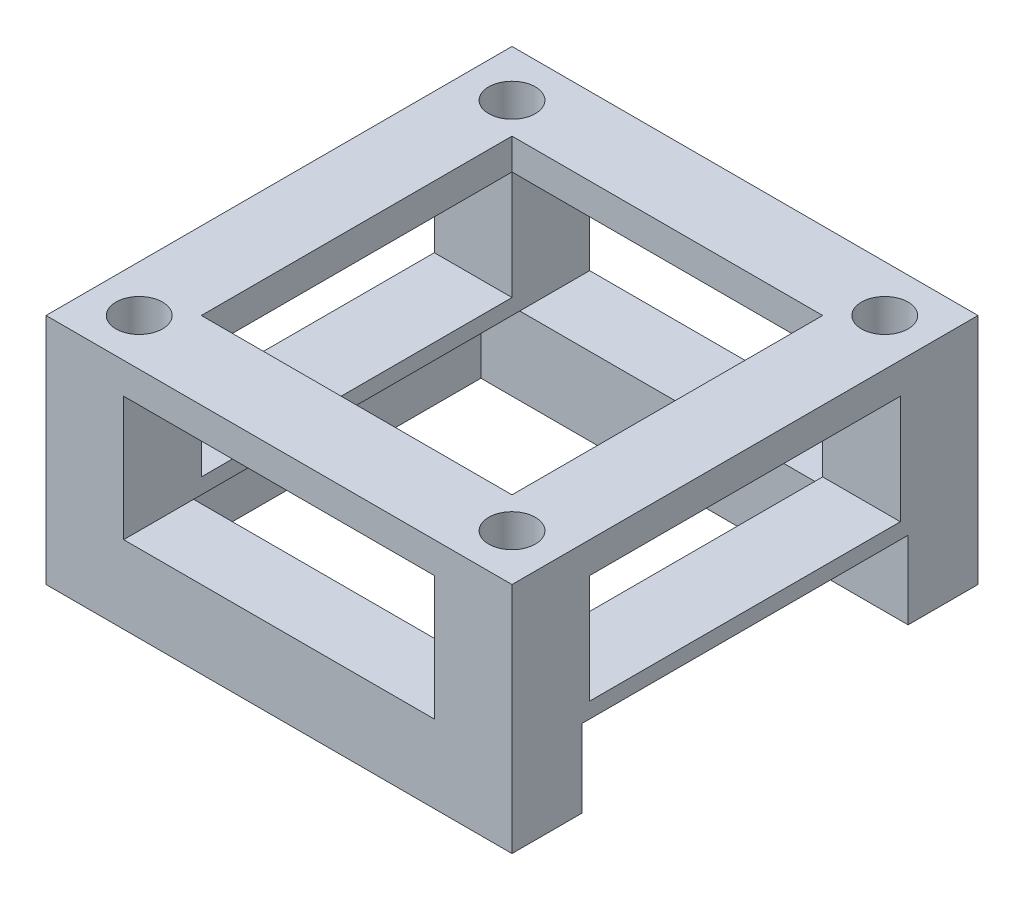
ISO-10303-21;
HEADER;
FILE_DESCRIPTION(('STEP AP214'),'2;1');
FILE_NAME('part.step','',(''),(''),'','','');
FILE_SCHEMA(('AUTOMOTIVE_DESIGN { 1 0 10303 214 1 1 1 1 }'));
ENDSEC;
DATA;
#1=APPLICATION_CONTEXT('core data for automotive mechanical design processes');
#2=APPLICATION_PROTOCOL_DEFINITION('international standard','automotive_design',2000,#1);
#3=PRODUCT_CONTEXT('',#1,'mechanical');
#4=PRODUCT('Part','Part','',(#3));
#5=PRODUCT_RELATED_PRODUCT_CATEGORY('part','',(#4));
#6=PRODUCT_DEFINITION_FORMATION('','',#4);
#7=PRODUCT_DEFINITION_CONTEXT('part definition',#1,'design');
#8=PRODUCT_DEFINITION('design','',#6,#7);
#9=PRODUCT_DEFINITION_SHAPE('','',#8);
#10=(LENGTH_UNIT() NAMED_UNIT(*) SI_UNIT(.MILLI.,.METRE.));
#11=(NAMED_UNIT(*) PLANE_ANGLE_UNIT() SI_UNIT($,.RADIAN.));
#12=(NAMED_UNIT(*) SI_UNIT($,.STERADIAN.) SOLID_ANGLE_UNIT());
#13=UNCERTAINTY_MEASURE_WITH_UNIT(LENGTH_MEASURE(1.E-05),#10,'distance_accuracy_value','');
#14=(GEOMETRIC_REPRESENTATION_CONTEXT(3) GLOBAL_UNCERTAINTY_ASSIGNED_CONTEXT((#13)) GLOBAL_UNIT_ASSIGNED_CONTEXT((#10,
#11,#12)) REPRESENTATION_CONTEXT('',''));
#15=CARTESIAN_POINT('',(0.,0.,0.));
#16=DIRECTION('',(0.,0.,1.));
#17=DIRECTION('',(1.,0.,0.));
#18=AXIS2_PLACEMENT_3D('',#15,#16,#17);
#19=CARTESIAN_POINT('',(-15.,5.,0.));
#20=DIRECTION('',(-1.,0.,0.));
#21=DIRECTION('',(0.,0.,1.));
#22=AXIS2_PLACEMENT_3D('',#19,#20,#21);
#23=PLANE('',#22);
#24=DIRECTION('',(0.,0.,-1.));
#25=VECTOR('',#24,1.);
#26=CARTESIAN_POINT('',(-15.,0.,0.));
#27=LINE('',#26,#25);
#28=CARTESIAN_POINT('',(-15.,0.,15.));
#29=VERTEX_POINT('',#28);
#30=CARTESIAN_POINT('',(-15.,0.,-15.));
#31=VERTEX_POINT('',#30);
#32=EDGE_CURVE('E464',#29,#31,#27,.T.);
#33=ORIENTED_EDGE('',*,*,#32,.F.);
#34=DIRECTION('',(0.,-1.,0.));
#35=VECTOR('',#34,1.);
#36=CARTESIAN_POINT('',(-15.,5.,15.));
#37=LINE('',#36,#35);
#38=CARTESIAN_POINT('',(-15.,15.,15.));
#39=VERTEX_POINT('',#38);
#40=EDGE_CURVE('E477',#39,#29,#37,.T.);
#41=ORIENTED_EDGE('',*,*,#40,.F.);
#42=DIRECTION('',(0.,0.,1.));
#43=VECTOR('',#42,1.);
#44=CARTESIAN_POINT('',(-15.,15.,15.));
#45=LINE('',#44,#43);
#46=CARTESIAN_POINT('',(-15.,15.,-15.));
#47=VERTEX_POINT('',#46);
#48=EDGE_CURVE('E411',#47,#39,#45,.T.);
#49=ORIENTED_EDGE('',*,*,#48,.F.);
#50=DIRECTION('',(0.,-1.,0.));
#51=VECTOR('',#50,1.);
#52=CARTESIAN_POINT('',(-15.,5.,-15.));
#53=LINE('',#52,#51);
#54=EDGE_CURVE('E480',#47,#31,#53,.T.);
#55=ORIENTED_EDGE('',*,*,#54,.T.);
#56=EDGE_LOOP('',(#33,#41,#49,#55));
#57=FACE_BOUND('',#56,.T.);
#58=DIRECTION('',(0.,0.,1.));
#59=VECTOR('',#58,1.);
#60=CARTESIAN_POINT('',(-15.,13.,0.));
#61=LINE('',#60,#59);
#62=CARTESIAN_POINT('',(-15.,13.,-10.));
#63=VERTEX_POINT('',#62);
#64=CARTESIAN_POINT('',(-15.,13.,10.));
#65=VERTEX_POINT('',#64);
#66=EDGE_CURVE('E273',#63,#65,#61,.T.);
#67=ORIENTED_EDGE('',*,*,#66,.T.);
#68=DIRECTION('',(0.,-1.,0.));
#69=VECTOR('',#68,1.);
#70=CARTESIAN_POINT('',(-15.,5.00000000000001,10.));
#71=LINE('',#70,#69);
#72=CARTESIAN_POINT('',(-15.,6.,10.));
#73=VERTEX_POINT('',#72);
#74=EDGE_CURVE('E255',#65,#73,#71,.T.);
#75=ORIENTED_EDGE('',*,*,#74,.T.);
#76=DIRECTION('',(0.,0.,1.));
#77=VECTOR('',#76,1.);
#78=CARTESIAN_POINT('',(-15.,6.,0.));
#79=LINE('',#78,#77);
#80=CARTESIAN_POINT('',(-15.,6.,-9.99999999999999));
#81=VERTEX_POINT('',#80);
#82=EDGE_CURVE('E280',#81,#73,#79,.T.);
#83=ORIENTED_EDGE('',*,*,#82,.F.);
#84=DIRECTION('',(0.,-1.,0.));
#85=VECTOR('',#84,1.);
#86=CARTESIAN_POINT('',(-15.,4.99999999999999,-9.99999999999999));
#87=LINE('',#86,#85);
#88=EDGE_CURVE('E266',#63,#81,#87,.T.);
#89=ORIENTED_EDGE('',*,*,#88,.F.);
#90=EDGE_LOOP('',(#67,#75,#83,#89));
#91=FACE_BOUND('',#90,.T.);
#92=ADVANCED_FACE('F45',(#57,#91),#23,.T.);
#93=CARTESIAN_POINT('',(15.,5.,0.));
#94=DIRECTION('',(-1.,0.,0.));
#95=DIRECTION('',(0.,0.,1.));
#96=AXIS2_PLACEMENT_3D('',#93,#94,#95);
#97=PLANE('',#96);
#98=DIRECTION('',(0.,0.,-1.));
#99=VECTOR('',#98,1.);
#100=CARTESIAN_POINT('',(15.,0.,0.));
#101=LINE('',#100,#99);
#102=CARTESIAN_POINT('',(15.,0.,15.));
#103=VERTEX_POINT('',#102);
#104=CARTESIAN_POINT('',(15.,0.,10.5));
#105=VERTEX_POINT('',#104);
#106=EDGE_CURVE('E460',#103,#105,#101,.T.);
#107=ORIENTED_EDGE('',*,*,#106,.T.);
#108=DIRECTION('',(0.,-1.,0.));
#109=VECTOR('',#108,1.);
#110=CARTESIAN_POINT('',(15.,5.,10.5));
#111=LINE('',#110,#109);
#112=CARTESIAN_POINT('',(15.,5.,10.5));
#113=VERTEX_POINT('',#112);
#114=EDGE_CURVE('E445',#113,#105,#111,.T.);
#115=ORIENTED_EDGE('',*,*,#114,.F.);
#116=DIRECTION('',(0.,0.,-1.));
#117=VECTOR('',#116,1.);
#118=CARTESIAN_POINT('',(15.,5.,15.));
#119=LINE('',#118,#117);
#120=CARTESIAN_POINT('',(15.,5.,-10.5));
#121=VERTEX_POINT('',#120);
#122=EDGE_CURVE('E410',#113,#121,#119,.T.);
#123=ORIENTED_EDGE('',*,*,#122,.T.);
#124=DIRECTION('',(0.,-1.,0.));
#125=VECTOR('',#124,1.);
#126=CARTESIAN_POINT('',(15.,5.,-10.5));
#127=LINE('',#126,#125);
#128=CARTESIAN_POINT('',(15.,0.,-10.5));
#129=VERTEX_POINT('',#128);
#130=EDGE_CURVE('E486',#121,#129,#127,.T.);
#131=ORIENTED_EDGE('',*,*,#130,.T.);
#132=CARTESIAN_POINT('',(15.,0.,-15.));
#133=VERTEX_POINT('',#132);
#134=EDGE_CURVE('E455',#129,#133,#101,.T.);
#135=ORIENTED_EDGE('',*,*,#134,.T.);
#136=DIRECTION('',(0.,-1.,0.));
#137=VECTOR('',#136,1.);
#138=CARTESIAN_POINT('',(15.,5.,-15.));
#139=LINE('',#138,#137);
#140=CARTESIAN_POINT('',(15.,15.,-15.));
#141=VERTEX_POINT('',#140);
#142=EDGE_CURVE('E483',#141,#133,#139,.T.);
#143=ORIENTED_EDGE('',*,*,#142,.F.);
#144=DIRECTION('',(0.,0.,-1.));
#145=VECTOR('',#144,1.);
#146=CARTESIAN_POINT('',(15.,15.,15.));
#147=LINE('',#146,#145);
#148=CARTESIAN_POINT('',(15.,15.,15.));
#149=VERTEX_POINT('',#148);
#150=EDGE_CURVE('E419',#149,#141,#147,.T.);
#151=ORIENTED_EDGE('',*,*,#150,.F.);
#152=DIRECTION('',(0.,-1.,0.));
#153=VECTOR('',#152,1.);
#154=CARTESIAN_POINT('',(15.,5.,15.));
#155=LINE('',#154,#153);
#156=EDGE_CURVE('E473',#149,#103,#155,.T.);
#157=ORIENTED_EDGE('',*,*,#156,.T.);
#158=EDGE_LOOP('',(#107,#115,#123,#131,#135,#143,#151,#157));
#159=FACE_BOUND('',#158,.T.);
#160=DIRECTION('',(0.,-1.,0.));
#161=VECTOR('',#160,1.);
#162=CARTESIAN_POINT('',(15.,0.,10.));
#163=LINE('',#162,#161);
#164=CARTESIAN_POINT('',(15.,13.,10.));
#165=VERTEX_POINT('',#164);
#166=CARTESIAN_POINT('',(15.,6.,10.));
#167=VERTEX_POINT('',#166);
#168=EDGE_CURVE('E215',#165,#167,#163,.T.);
#169=ORIENTED_EDGE('',*,*,#168,.F.);
#170=DIRECTION('',(0.,0.,1.));
#171=VECTOR('',#170,1.);
#172=CARTESIAN_POINT('',(15.,13.,0.));
#173=LINE('',#172,#171);
#174=CARTESIAN_POINT('',(15.,13.,-10.));
#175=VERTEX_POINT('',#174);
#176=EDGE_CURVE('E206',#175,#165,#173,.T.);
#177=ORIENTED_EDGE('',*,*,#176,.F.);
#178=DIRECTION('',(0.,-1.,0.));
#179=VECTOR('',#178,1.);
#180=CARTESIAN_POINT('',(15.,0.,-9.99999999999999));
#181=LINE('',#180,#179);
#182=CARTESIAN_POINT('',(15.,6.,-9.99999999999999));
#183=VERTEX_POINT('',#182);
#184=EDGE_CURVE('E69',#175,#183,#181,.T.);
#185=ORIENTED_EDGE('',*,*,#184,.T.);
#186=DIRECTION('',(0.,0.,1.));
#187=VECTOR('',#186,1.);
#188=CARTESIAN_POINT('',(15.,6.,0.));
#189=LINE('',#188,#187);
#190=EDGE_CURVE('E230',#183,#167,#189,.T.);
#191=ORIENTED_EDGE('',*,*,#190,.T.);
#192=EDGE_LOOP('',(#169,#177,#185,#191));
#193=FACE_BOUND('',#192,.T.);
#194=ADVANCED_FACE('F228',(#159,#193),#97,.F.);
#195=CARTESIAN_POINT('',(-10.,15.,10.));
#196=DIRECTION('',(1.,0.,0.));
#197=DIRECTION('',(0.,0.,-1.));
#198=AXIS2_PLACEMENT_3D('',#195,#196,#197);
#199=PLANE('',#198);
#200=DIRECTION('',(0.,0.,-1.));
#201=VECTOR('',#200,1.);
#202=CARTESIAN_POINT('',(-10.,6.,10.));
#203=LINE('',#202,#201);
#204=CARTESIAN_POINT('',(-10.,6.,10.));
#205=VERTEX_POINT('',#204);
#206=CARTESIAN_POINT('',(-10.,6.,-9.99999999999999));
#207=VERTEX_POINT('',#206);
#208=EDGE_CURVE('E277',#205,#207,#203,.T.);
#209=ORIENTED_EDGE('',*,*,#208,.F.);
#210=DIRECTION('',(0.,1.,0.));
#211=VECTOR('',#210,1.);
#212=CARTESIAN_POINT('',(-10.,15.,10.));
#213=LINE('',#212,#211);
#214=CARTESIAN_POINT('',(-9.99999999999999,13.,10.));
#215=VERTEX_POINT('',#214);
#216=EDGE_CURVE('E251',#205,#215,#213,.T.);
#217=ORIENTED_EDGE('',*,*,#216,.T.);
#218=DIRECTION('',(0.,0.,-1.));
#219=VECTOR('',#218,1.);
#220=CARTESIAN_POINT('',(-10.,13.,15.));
#221=LINE('',#220,#219);
#222=CARTESIAN_POINT('',(-10.,13.,15.));
#223=VERTEX_POINT('',#222);
#224=EDGE_CURVE('E314',#223,#215,#221,.T.);
#225=ORIENTED_EDGE('',*,*,#224,.F.);
#226=DIRECTION('',(0.,-1.,0.));
#227=VECTOR('',#226,1.);
#228=CARTESIAN_POINT('',(-10.,0.,15.));
#229=LINE('',#228,#227);
#230=CARTESIAN_POINT('',(-10.,5.,15.));
#231=VERTEX_POINT('',#230);
#232=EDGE_CURVE('E283',#223,#231,#229,.T.);
#233=ORIENTED_EDGE('',*,*,#232,.T.);
#234=DIRECTION('',(0.,0.,-1.));
#235=VECTOR('',#234,1.);
#236=CARTESIAN_POINT('',(-10.,5.,15.));
#237=LINE('',#236,#235);
#238=CARTESIAN_POINT('',(-10.,5.,10.5));
#239=VERTEX_POINT('',#238);
#240=EDGE_CURVE('E298',#231,#239,#237,.T.);
#241=ORIENTED_EDGE('',*,*,#240,.T.);
#242=DIRECTION('',(0.,0.,1.));
#243=VECTOR('',#242,1.);
#244=CARTESIAN_POINT('',(-10.,5.,10.));
#245=LINE('',#244,#243);
#246=CARTESIAN_POINT('',(-10.,5.,-10.5));
#247=VERTEX_POINT('',#246);
#248=EDGE_CURVE('E372',#247,#239,#245,.T.);
#249=ORIENTED_EDGE('',*,*,#248,.F.);
#250=CARTESIAN_POINT('',(-10.,5.,-15.));
#251=VERTEX_POINT('',#250);
#252=EDGE_CURVE('E303',#247,#251,#237,.T.);
#253=ORIENTED_EDGE('',*,*,#252,.T.);
#254=DIRECTION('',(0.,-1.,0.));
#255=VECTOR('',#254,1.);
#256=CARTESIAN_POINT('',(-10.,5.,-15.));
#257=LINE('',#256,#255);
#258=CARTESIAN_POINT('',(-10.,13.,-15.));
#259=VERTEX_POINT('',#258);
#260=EDGE_CURVE('E339',#259,#251,#257,.T.);
#261=ORIENTED_EDGE('',*,*,#260,.F.);
#262=CARTESIAN_POINT('',(-10.,13.,-10.));
#263=VERTEX_POINT('',#262);
#264=EDGE_CURVE('E297',#263,#259,#221,.T.);
#265=ORIENTED_EDGE('',*,*,#264,.F.);
#266=DIRECTION('',(0.,1.,0.));
#267=VECTOR('',#266,1.);
#268=CARTESIAN_POINT('',(-10.,15.,-10.));
#269=LINE('',#268,#267);
#270=EDGE_CURVE('E262',#207,#263,#269,.T.);
#271=ORIENTED_EDGE('',*,*,#270,.F.);
#272=EDGE_LOOP('',(#209,#217,#225,#233,#241,#249,#253,#261,#265,#271));
#273=FACE_BOUND('',#272,.T.);
#274=ADVANCED_FACE('F537',(#273),#199,.T.);
#275=DIRECTION('',(0.,-1.,0.));
#276=VECTOR('',#275,1.);
#277=CARTESIAN_POINT('',(-10.,15.,10.));
#278=LINE('',#277,#276);
#279=CARTESIAN_POINT('',(-10.,15.,10.));
#280=VERTEX_POINT('',#279);
#281=EDGE_CURVE('E406',#280,#215,#278,.T.);
#282=ORIENTED_EDGE('',*,*,#281,.T.);
#283=DIRECTION('',(0.,0.,-1.));
#284=VECTOR('',#283,1.);
#285=CARTESIAN_POINT('',(-10.,13.,10.));
#286=LINE('',#285,#284);
#287=EDGE_CURVE('E269',#215,#263,#286,.T.);
#288=ORIENTED_EDGE('',*,*,#287,.T.);
#289=DIRECTION('',(0.,-1.,0.));
#290=VECTOR('',#289,1.);
#291=CARTESIAN_POINT('',(-10.,15.,-10.));
#292=LINE('',#291,#290);
#293=CARTESIAN_POINT('',(-10.,15.,-10.));
#294=VERTEX_POINT('',#293);
#295=EDGE_CURVE('E390',#294,#263,#292,.T.);
#296=ORIENTED_EDGE('',*,*,#295,.F.);
#297=DIRECTION('',(0.,0.,1.));
#298=VECTOR('',#297,1.);
#299=CARTESIAN_POINT('',(-10.,15.,10.));
#300=LINE('',#299,#298);
#301=EDGE_CURVE('E376',#294,#280,#300,.T.);
#302=ORIENTED_EDGE('',*,*,#301,.T.);
#303=EDGE_LOOP('',(#282,#288,#296,#302));
#304=FACE_BOUND('',#303,.T.);
#305=ADVANCED_FACE('F526',(#304),#199,.T.);
#306=CARTESIAN_POINT('',(10.,15.,10.));
#307=DIRECTION('',(-1.,0.,0.));
#308=DIRECTION('',(0.,0.,1.));
#309=AXIS2_PLACEMENT_3D('',#306,#307,#308);
#310=PLANE('',#309);
#311=DIRECTION('',(0.,0.,-1.));
#312=VECTOR('',#311,1.);
#313=CARTESIAN_POINT('',(10.,13.,15.));
#314=LINE('',#313,#312);
#315=CARTESIAN_POINT('',(10.,13.,15.));
#316=VERTEX_POINT('',#315);
#317=CARTESIAN_POINT('',(10.,13.,10.));
#318=VERTEX_POINT('',#317);
#319=EDGE_CURVE('E309',#316,#318,#314,.T.);
#320=ORIENTED_EDGE('',*,*,#319,.T.);
#321=DIRECTION('',(0.,-1.,0.));
#322=VECTOR('',#321,1.);
#323=CARTESIAN_POINT('',(10.,15.,10.));
#324=LINE('',#323,#322);
#325=CARTESIAN_POINT('',(10.,6.,10.));
#326=VERTEX_POINT('',#325);
#327=EDGE_CURVE('E222',#318,#326,#324,.T.);
#328=ORIENTED_EDGE('',*,*,#327,.T.);
#329=DIRECTION('',(0.,0.,1.));
#330=VECTOR('',#329,1.);
#331=CARTESIAN_POINT('',(10.,6.,10.));
#332=LINE('',#331,#330);
#333=CARTESIAN_POINT('',(10.,6.,-9.99999999999999));
#334=VERTEX_POINT('',#333);
#335=EDGE_CURVE('E11',#334,#326,#332,.T.);
#336=ORIENTED_EDGE('',*,*,#335,.F.);
#337=DIRECTION('',(0.,-1.,0.));
#338=VECTOR('',#337,1.);
#339=CARTESIAN_POINT('',(10.,15.,-10.));
#340=LINE('',#339,#338);
#341=CARTESIAN_POINT('',(10.,13.,-10.));
#342=VERTEX_POINT('',#341);
#343=EDGE_CURVE('E259',#342,#334,#340,.T.);
#344=ORIENTED_EDGE('',*,*,#343,.F.);
#345=CARTESIAN_POINT('',(10.,13.,-15.));
#346=VERTEX_POINT('',#345);
#347=EDGE_CURVE('E313',#342,#346,#314,.T.);
#348=ORIENTED_EDGE('',*,*,#347,.T.);
#349=DIRECTION('',(0.,-1.,0.));
#350=VECTOR('',#349,1.);
#351=CARTESIAN_POINT('',(10.,5.,-15.));
#352=LINE('',#351,#350);
#353=CARTESIAN_POINT('',(10.,5.,-15.));
#354=VERTEX_POINT('',#353);
#355=EDGE_CURVE('E325',#346,#354,#352,.T.);
#356=ORIENTED_EDGE('',*,*,#355,.T.);
#357=DIRECTION('',(0.,0.,-1.));
#358=VECTOR('',#357,1.);
#359=CARTESIAN_POINT('',(10.,5.,15.));
#360=LINE('',#359,#358);
#361=CARTESIAN_POINT('',(10.,5.,-10.5));
#362=VERTEX_POINT('',#361);
#363=EDGE_CURVE('E308',#362,#354,#360,.T.);
#364=ORIENTED_EDGE('',*,*,#363,.F.);
#365=DIRECTION('',(0.,0.,-1.));
#366=VECTOR('',#365,1.);
#367=CARTESIAN_POINT('',(10.,5.,10.));
#368=LINE('',#367,#366);
#369=CARTESIAN_POINT('',(10.,5.,10.5));
#370=VERTEX_POINT('',#369);
#371=EDGE_CURVE('E380',#370,#362,#368,.T.);
#372=ORIENTED_EDGE('',*,*,#371,.F.);
#373=CARTESIAN_POINT('',(10.,5.,15.));
#374=VERTEX_POINT('',#373);
#375=EDGE_CURVE('E304',#374,#370,#360,.T.);
#376=ORIENTED_EDGE('',*,*,#375,.F.);
#377=DIRECTION('',(0.,-1.,0.));
#378=VECTOR('',#377,1.);
#379=CARTESIAN_POINT('',(10.,0.,15.));
#380=LINE('',#379,#378);
#381=EDGE_CURVE('E289',#316,#374,#380,.T.);
#382=ORIENTED_EDGE('',*,*,#381,.F.);
#383=EDGE_LOOP('',(#320,#328,#336,#344,#348,#356,#364,#372,#376,#382));
#384=FACE_BOUND('',#383,.T.);
#385=ADVANCED_FACE('F514',(#384),#310,.T.);
#386=DIRECTION('',(0.,-1.,0.));
#387=VECTOR('',#386,1.);
#388=CARTESIAN_POINT('',(10.,15.,-10.));
#389=LINE('',#388,#387);
#390=CARTESIAN_POINT('',(10.,15.,-10.));
#391=VERTEX_POINT('',#390);
#392=EDGE_CURVE('E398',#391,#342,#389,.T.);
#393=ORIENTED_EDGE('',*,*,#392,.T.);
#394=DIRECTION('',(0.,0.,1.));
#395=VECTOR('',#394,1.);
#396=CARTESIAN_POINT('',(10.,13.,10.));
#397=LINE('',#396,#395);
#398=EDGE_CURVE('E54',#342,#318,#397,.T.);
#399=ORIENTED_EDGE('',*,*,#398,.T.);
#400=DIRECTION('',(0.,-1.,0.));
#401=VECTOR('',#400,1.);
#402=CARTESIAN_POINT('',(10.,15.,10.));
#403=LINE('',#402,#401);
#404=CARTESIAN_POINT('',(10.,15.,10.));
#405=VERTEX_POINT('',#404);
#406=EDGE_CURVE('E402',#405,#318,#403,.T.);
#407=ORIENTED_EDGE('',*,*,#406,.F.);
#408=DIRECTION('',(0.,0.,-1.));
#409=VECTOR('',#408,1.);
#410=CARTESIAN_POINT('',(10.,15.,10.));
#411=LINE('',#410,#409);
#412=EDGE_CURVE('E383',#405,#391,#411,.T.);
#413=ORIENTED_EDGE('',*,*,#412,.T.);
#414=EDGE_LOOP('',(#393,#399,#407,#413));
#415=FACE_BOUND('',#414,.T.);
#416=ADVANCED_FACE('F504',(#415),#310,.T.);
#417=CARTESIAN_POINT('',(0.,5.,-15.));
#418=DIRECTION('',(0.,0.,-1.));
#419=DIRECTION('',(-1.,0.,0.));
#420=AXIS2_PLACEMENT_3D('',#417,#418,#419);
#421=PLANE('',#420);
#422=DIRECTION('',(1.,0.,0.));
#423=VECTOR('',#422,1.);
#424=CARTESIAN_POINT('',(0.,0.,-15.));
#425=LINE('',#424,#423);
#426=EDGE_CURVE('E459',#31,#133,#425,.T.);
#427=ORIENTED_EDGE('',*,*,#426,.F.);
#428=ORIENTED_EDGE('',*,*,#54,.F.);
#429=DIRECTION('',(-1.,0.,0.));
#430=VECTOR('',#429,1.);
#431=CARTESIAN_POINT('',(15.,15.,-15.));
#432=LINE('',#431,#430);
#433=EDGE_CURVE('E423',#141,#47,#432,.T.);
#434=ORIENTED_EDGE('',*,*,#433,.F.);
#435=ORIENTED_EDGE('',*,*,#142,.T.);
#436=EDGE_LOOP('',(#427,#428,#434,#435));
#437=FACE_BOUND('',#436,.T.);
#438=DIRECTION('',(-1.,0.,0.));
#439=VECTOR('',#438,1.);
#440=CARTESIAN_POINT('',(0.,13.,-15.));
#441=LINE('',#440,#439);
#442=EDGE_CURVE('E321',#346,#259,#441,.T.);
#443=ORIENTED_EDGE('',*,*,#442,.T.);
#444=ORIENTED_EDGE('',*,*,#260,.T.);
#445=DIRECTION('',(-1.,0.,0.));
#446=VECTOR('',#445,1.);
#447=CARTESIAN_POINT('',(0.,5.,-15.));
#448=LINE('',#447,#446);
#449=EDGE_CURVE('E328',#354,#251,#448,.T.);
#450=ORIENTED_EDGE('',*,*,#449,.F.);
#451=ORIENTED_EDGE('',*,*,#355,.F.);
#452=EDGE_LOOP('',(#443,#444,#450,#451));
#453=FACE_BOUND('',#452,.T.);
#454=ADVANCED_FACE('F592',(#437,#453),#421,.T.);
#455=CARTESIAN_POINT('',(0.,5.,15.));
#456=DIRECTION('',(0.,0.,-1.));
#457=DIRECTION('',(-1.,0.,0.));
#458=AXIS2_PLACEMENT_3D('',#455,#456,#457);
#459=PLANE('',#458);
#460=DIRECTION('',(1.,0.,0.));
#461=VECTOR('',#460,1.);
#462=CARTESIAN_POINT('',(0.,0.,15.));
#463=LINE('',#462,#461);
#464=EDGE_CURVE('E468',#29,#103,#463,.T.);
#465=ORIENTED_EDGE('',*,*,#464,.T.);
#466=ORIENTED_EDGE('',*,*,#156,.F.);
#467=DIRECTION('',(1.,0.,0.));
#468=VECTOR('',#467,1.);
#469=CARTESIAN_POINT('',(15.,15.,15.));
#470=LINE('',#469,#468);
#471=EDGE_CURVE('E415',#39,#149,#470,.T.);
#472=ORIENTED_EDGE('',*,*,#471,.F.);
#473=ORIENTED_EDGE('',*,*,#40,.T.);
#474=EDGE_LOOP('',(#465,#466,#472,#473));
#475=FACE_BOUND('',#474,.T.);
#476=ORIENTED_EDGE('',*,*,#232,.F.);
#477=DIRECTION('',(-1.,0.,0.));
#478=VECTOR('',#477,1.);
#479=CARTESIAN_POINT('',(0.,13.,15.));
#480=LINE('',#479,#478);
#481=EDGE_CURVE('E286',#316,#223,#480,.T.);
#482=ORIENTED_EDGE('',*,*,#481,.F.);
#483=ORIENTED_EDGE('',*,*,#381,.T.);
#484=DIRECTION('',(-1.,0.,0.));
#485=VECTOR('',#484,1.);
#486=CARTESIAN_POINT('',(0.,5.,15.));
#487=LINE('',#486,#485);
#488=EDGE_CURVE('E293',#374,#231,#487,.T.);
#489=ORIENTED_EDGE('',*,*,#488,.T.);
#490=EDGE_LOOP('',(#476,#482,#483,#489));
#491=FACE_BOUND('',#490,.T.);
#492=ADVANCED_FACE('F562',(#475,#491),#459,.F.);
#493=CARTESIAN_POINT('',(0.,5.,0.));
#494=DIRECTION('',(0.,1.,0.));
#495=DIRECTION('',(0.,0.,1.));
#496=AXIS2_PLACEMENT_3D('',#493,#494,#495);
#497=PLANE('',#496);
#498=ORIENTED_EDGE('',*,*,#248,.T.);
#499=DIRECTION('',(1.,0.,0.));
#500=VECTOR('',#499,1.);
#501=CARTESIAN_POINT('',(0.,5.,10.5));
#502=LINE('',#501,#500);
#503=CARTESIAN_POINT('',(-12.5,5.,10.5));
#504=VERTEX_POINT('',#503);
#505=EDGE_CURVE('E431',#504,#239,#502,.T.);
#506=ORIENTED_EDGE('',*,*,#505,.F.);
#507=DIRECTION('',(0.,0.,-1.));
#508=VECTOR('',#507,1.);
#509=CARTESIAN_POINT('',(-12.5,5.,0.));
#510=LINE('',#509,#508);
#511=CARTESIAN_POINT('',(-12.5,5.,-10.5));
#512=VERTEX_POINT('',#511);
#513=EDGE_CURVE('E435',#504,#512,#510,.T.);
#514=ORIENTED_EDGE('',*,*,#513,.T.);
#515=DIRECTION('',(1.,0.,0.));
#516=VECTOR('',#515,1.);
#517=CARTESIAN_POINT('',(0.,5.,-10.5));
#518=LINE('',#517,#516);
#519=EDGE_CURVE('E441',#512,#247,#518,.T.);
#520=ORIENTED_EDGE('',*,*,#519,.T.);
#521=EDGE_LOOP('',(#498,#506,#514,#520));
#522=FACE_BOUND('',#521,.T.);
#523=ADVANCED_FACE('F574',(#522),#497,.F.);
#524=CARTESIAN_POINT('',(10.,15.,10.));
#525=DIRECTION('',(0.,0.,-1.));
#526=DIRECTION('',(-1.,0.,0.));
#527=AXIS2_PLACEMENT_3D('',#524,#525,#526);
#528=PLANE('',#527);
#529=ORIENTED_EDGE('',*,*,#406,.T.);
#530=DIRECTION('',(-1.,0.,0.));
#531=VECTOR('',#530,1.);
#532=CARTESIAN_POINT('',(10.,13.,10.));
#533=LINE('',#532,#531);
#534=EDGE_CURVE('E302',#318,#215,#533,.T.);
#535=ORIENTED_EDGE('',*,*,#534,.T.);
#536=ORIENTED_EDGE('',*,*,#281,.F.);
#537=DIRECTION('',(1.,0.,0.));
#538=VECTOR('',#537,1.);
#539=CARTESIAN_POINT('',(10.,15.,10.));
#540=LINE('',#539,#538);
#541=EDGE_CURVE('E379',#280,#405,#540,.T.);
#542=ORIENTED_EDGE('',*,*,#541,.T.);
#543=EDGE_LOOP('',(#529,#535,#536,#542));
#544=FACE_BOUND('',#543,.T.);
#545=ADVANCED_FACE('F516',(#544),#528,.T.);
#546=CARTESIAN_POINT('',(10.,15.,-10.));
#547=DIRECTION('',(0.,0.,1.));
#548=DIRECTION('',(1.,0.,0.));
#549=AXIS2_PLACEMENT_3D('',#546,#547,#548);
#550=PLANE('',#549);
#551=ORIENTED_EDGE('',*,*,#295,.T.);
#552=DIRECTION('',(1.,0.,0.));
#553=VECTOR('',#552,1.);
#554=CARTESIAN_POINT('',(10.,13.,-10.));
#555=LINE('',#554,#553);
#556=EDGE_CURVE('E497',#263,#342,#555,.T.);
#557=ORIENTED_EDGE('',*,*,#556,.T.);
#558=ORIENTED_EDGE('',*,*,#392,.F.);
#559=DIRECTION('',(-1.,0.,0.));
#560=VECTOR('',#559,1.);
#561=CARTESIAN_POINT('',(10.,15.,-10.));
#562=LINE('',#561,#560);
#563=EDGE_CURVE('E387',#391,#294,#562,.T.);
#564=ORIENTED_EDGE('',*,*,#563,.T.);
#565=EDGE_LOOP('',(#551,#557,#558,#564));
#566=FACE_BOUND('',#565,.T.);
#567=ADVANCED_FACE('F524',(#566),#550,.T.);
#568=CARTESIAN_POINT('',(0.,5.,10.5));
#569=DIRECTION('',(0.,0.,-1.));
#570=DIRECTION('',(-1.,0.,0.));
#571=AXIS2_PLACEMENT_3D('',#568,#569,#570);
#572=PLANE('',#571);
#573=DIRECTION('',(1.,0.,0.));
#574=VECTOR('',#573,1.);
#575=CARTESIAN_POINT('',(0.,0.,10.5));
#576=LINE('',#575,#574);
#577=CARTESIAN_POINT('',(-12.5,0.,10.5));
#578=VERTEX_POINT('',#577);
#579=EDGE_CURVE('E427',#578,#105,#576,.T.);
#580=ORIENTED_EDGE('',*,*,#579,.F.);
#581=DIRECTION('',(0.,-1.,0.));
#582=VECTOR('',#581,1.);
#583=CARTESIAN_POINT('',(-12.5,5.,10.5));
#584=LINE('',#583,#582);
#585=EDGE_CURVE('E494',#504,#578,#584,.T.);
#586=ORIENTED_EDGE('',*,*,#585,.F.);
#587=ORIENTED_EDGE('',*,*,#505,.T.);
#588=DIRECTION('',(-1.,0.,0.));
#589=VECTOR('',#588,1.);
#590=CARTESIAN_POINT('',(0.,5.,10.5));
#591=LINE('',#590,#589);
#592=EDGE_CURVE('E335',#370,#239,#591,.T.);
#593=ORIENTED_EDGE('',*,*,#592,.F.);
#594=EDGE_CURVE('E436',#370,#113,#502,.T.);
#595=ORIENTED_EDGE('',*,*,#594,.T.);
#596=ORIENTED_EDGE('',*,*,#114,.T.);
#597=EDGE_LOOP('',(#580,#586,#587,#593,#595,#596));
#598=FACE_BOUND('',#597,.T.);
#599=ADVANCED_FACE('F47',(#598),#572,.T.);
#600=CARTESIAN_POINT('',(-12.5,5.,0.));
#601=DIRECTION('',(-1.,0.,0.));
#602=DIRECTION('',(0.,0.,1.));
#603=AXIS2_PLACEMENT_3D('',#600,#601,#602);
#604=PLANE('',#603);
#605=DIRECTION('',(0.,0.,-1.));
#606=VECTOR('',#605,1.);
#607=CARTESIAN_POINT('',(-12.5,0.,0.));
#608=LINE('',#607,#606);
#609=CARTESIAN_POINT('',(-12.5,0.,-10.5));
#610=VERTEX_POINT('',#609);
#611=EDGE_CURVE('E449',#578,#610,#608,.T.);
#612=ORIENTED_EDGE('',*,*,#611,.T.);
#613=DIRECTION('',(0.,-1.,0.));
#614=VECTOR('',#613,1.);
#615=CARTESIAN_POINT('',(-12.5,5.,-10.5));
#616=LINE('',#615,#614);
#617=EDGE_CURVE('E490',#512,#610,#616,.T.);
#618=ORIENTED_EDGE('',*,*,#617,.F.);
#619=ORIENTED_EDGE('',*,*,#513,.F.);
#620=ORIENTED_EDGE('',*,*,#585,.T.);
#621=EDGE_LOOP('',(#612,#618,#619,#620));
#622=FACE_BOUND('',#621,.T.);
#623=ADVANCED_FACE('F609',(#622),#604,.F.);
#624=CARTESIAN_POINT('',(0.,5.,-10.5));
#625=DIRECTION('',(0.,0.,-1.));
#626=DIRECTION('',(-1.,0.,0.));
#627=AXIS2_PLACEMENT_3D('',#624,#625,#626);
#628=PLANE('',#627);
#629=DIRECTION('',(1.,0.,0.));
#630=VECTOR('',#629,1.);
#631=CARTESIAN_POINT('',(0.,0.,-10.5));
#632=LINE('',#631,#630);
#633=EDGE_CURVE('E452',#610,#129,#632,.T.);
#634=ORIENTED_EDGE('',*,*,#633,.T.);
#635=ORIENTED_EDGE('',*,*,#130,.F.);
#636=EDGE_CURVE('E440',#362,#121,#518,.T.);
#637=ORIENTED_EDGE('',*,*,#636,.F.);
#638=DIRECTION('',(-1.,0.,0.));
#639=VECTOR('',#638,1.);
#640=CARTESIAN_POINT('',(0.,5.,-10.5));
#641=LINE('',#640,#639);
#642=EDGE_CURVE('E331',#362,#247,#641,.T.);
#643=ORIENTED_EDGE('',*,*,#642,.T.);
#644=ORIENTED_EDGE('',*,*,#519,.F.);
#645=ORIENTED_EDGE('',*,*,#617,.T.);
#646=EDGE_LOOP('',(#634,#635,#637,#643,#644,#645));
#647=FACE_BOUND('',#646,.T.);
#648=ADVANCED_FACE('F577',(#647),#628,.F.);
#649=CARTESIAN_POINT('',(0.,0.,0.));
#650=DIRECTION('',(0.,1.,0.));
#651=DIRECTION('',(0.,0.,1.));
#652=AXIS2_PLACEMENT_3D('',#649,#650,#651);
#653=PLANE('',#652);
#654=ORIENTED_EDGE('',*,*,#579,.T.);
#655=ORIENTED_EDGE('',*,*,#106,.F.);
#656=ORIENTED_EDGE('',*,*,#464,.F.);
#657=ORIENTED_EDGE('',*,*,#32,.T.);
#658=ORIENTED_EDGE('',*,*,#426,.T.);
#659=ORIENTED_EDGE('',*,*,#134,.F.);
#660=ORIENTED_EDGE('',*,*,#633,.F.);
#661=ORIENTED_EDGE('',*,*,#611,.F.);
#662=EDGE_LOOP('',(#654,#655,#656,#657,#658,#659,#660,#661));
#663=FACE_BOUND('',#662,.T.);
#664=ADVANCED_FACE('F606',(#663),#653,.F.);
#665=CARTESIAN_POINT('',(0.,15.,0.));
#666=DIRECTION('',(0.,1.,0.));
#667=DIRECTION('',(0.,0.,1.));
#668=AXIS2_PLACEMENT_3D('',#665,#666,#667);
#669=PLANE('',#668);
#670=CARTESIAN_POINT('',(-11.9999999999997,15.,12.));
#671=DIRECTION('',(0.,1.,0.));
#672=DIRECTION('',(0.,0.,1.));
#673=AXIS2_PLACEMENT_3D('',#670,#671,#672);
#674=CIRCLE('',#673,1.5);
#675=CARTESIAN_POINT('',(-11.9999999999997,15.,13.5));
#676=VERTEX_POINT('',#675);
#677=EDGE_CURVE('E343',#676,#676,#674,.T.);
#678=ORIENTED_EDGE('',*,*,#677,.F.);
#679=EDGE_LOOP('',(#678));
#680=FACE_BOUND('',#679,.T.);
#681=CARTESIAN_POINT('',(12.0000000000003,15.,12.));
#682=DIRECTION('',(0.,1.,0.));
#683=DIRECTION('',(0.,0.,1.));
#684=AXIS2_PLACEMENT_3D('',#681,#682,#683);
#685=CIRCLE('',#684,1.5);
#686=CARTESIAN_POINT('',(12.0000000000003,15.,13.5));
#687=VERTEX_POINT('',#686);
#688=EDGE_CURVE('E357',#687,#687,#685,.T.);
#689=ORIENTED_EDGE('',*,*,#688,.F.);
#690=EDGE_LOOP('',(#689));
#691=FACE_BOUND('',#690,.T.);
#692=CARTESIAN_POINT('',(12.,15.,-12.));
#693=DIRECTION('',(0.,1.,0.));
#694=DIRECTION('',(0.,0.,1.));
#695=AXIS2_PLACEMENT_3D('',#692,#693,#694);
#696=CIRCLE('',#695,1.5);
#697=CARTESIAN_POINT('',(12.,15.,-10.5));
#698=VERTEX_POINT('',#697);
#699=EDGE_CURVE('E349',#698,#698,#696,.T.);
#700=ORIENTED_EDGE('',*,*,#699,.F.);
#701=EDGE_LOOP('',(#700));
#702=FACE_BOUND('',#701,.T.);
#703=CARTESIAN_POINT('',(-12.,15.,-12.));
#704=DIRECTION('',(0.,1.,0.));
#705=DIRECTION('',(0.,0.,1.));
#706=AXIS2_PLACEMENT_3D('',#703,#704,#705);
#707=CIRCLE('',#706,1.5);
#708=CARTESIAN_POINT('',(-12.,15.,-10.5));
#709=VERTEX_POINT('',#708);
#710=EDGE_CURVE('E348',#709,#709,#707,.T.);
#711=ORIENTED_EDGE('',*,*,#710,.F.);
#712=EDGE_LOOP('',(#711));
#713=FACE_BOUND('',#712,.T.);
#714=ORIENTED_EDGE('',*,*,#48,.T.);
#715=ORIENTED_EDGE('',*,*,#471,.T.);
#716=ORIENTED_EDGE('',*,*,#150,.T.);
#717=ORIENTED_EDGE('',*,*,#433,.T.);
#718=EDGE_LOOP('',(#714,#715,#716,#717));
#719=FACE_BOUND('',#718,.T.);
#720=ORIENTED_EDGE('',*,*,#541,.F.);
#721=ORIENTED_EDGE('',*,*,#301,.F.);
#722=ORIENTED_EDGE('',*,*,#563,.F.);
#723=ORIENTED_EDGE('',*,*,#412,.F.);
#724=EDGE_LOOP('',(#720,#721,#722,#723));
#725=FACE_BOUND('',#724,.T.);
#726=ADVANCED_FACE('F520',(#680,#691,#702,#713,#719,#725),#669,.T.);
#727=ORIENTED_EDGE('',*,*,#594,.F.);
#728=ORIENTED_EDGE('',*,*,#371,.T.);
#729=ORIENTED_EDGE('',*,*,#636,.T.);
#730=ORIENTED_EDGE('',*,*,#122,.F.);
#731=EDGE_LOOP('',(#727,#728,#729,#730));
#732=FACE_BOUND('',#731,.T.);
#733=ADVANCED_FACE('F599',(#732),#497,.F.);
#734=CARTESIAN_POINT('',(-12.,10.,-12.));
#735=DIRECTION('',(0.,1.,0.));
#736=DIRECTION('',(0.,0.,1.));
#737=AXIS2_PLACEMENT_3D('',#734,#735,#736);
#738=CYLINDRICAL_SURFACE('',#737,1.5);
#739=CARTESIAN_POINT('',(-12.,10.,-12.));
#740=DIRECTION('',(0.,1.,0.));
#741=DIRECTION('',(0.,0.,1.));
#742=AXIS2_PLACEMENT_3D('',#739,#740,#741);
#743=CIRCLE('',#742,1.5);
#744=CARTESIAN_POINT('',(-12.,10.,-10.5));
#745=VERTEX_POINT('',#744);
#746=EDGE_CURVE('E368',#745,#745,#743,.T.);
#747=ORIENTED_EDGE('',*,*,#746,.F.);
#748=EDGE_LOOP('',(#747));
#749=FACE_BOUND('',#748,.T.);
#750=ORIENTED_EDGE('',*,*,#710,.T.);
#751=EDGE_LOOP('',(#750));
#752=FACE_BOUND('',#751,.T.);
#753=ADVANCED_FACE('F650',(#749,#752),#738,.F.);
#754=CARTESIAN_POINT('',(0.,10.,0.));
#755=DIRECTION('',(0.,1.,0.));
#756=DIRECTION('',(0.,0.,1.));
#757=AXIS2_PLACEMENT_3D('',#754,#755,#756);
#758=PLANE('',#757);
#759=ORIENTED_EDGE('',*,*,#746,.T.);
#760=EDGE_LOOP('',(#759));
#761=FACE_BOUND('',#760,.T.);
#762=ADVANCED_FACE('F664',(#761),#758,.T.);
#763=CARTESIAN_POINT('',(12.,10.,-12.));
#764=DIRECTION('',(0.,1.,0.));
#765=DIRECTION('',(0.,0.,1.));
#766=AXIS2_PLACEMENT_3D('',#763,#764,#765);
#767=CYLINDRICAL_SURFACE('',#766,1.5);
#768=CARTESIAN_POINT('',(12.,10.,-12.));
#769=DIRECTION('',(0.,1.,0.));
#770=DIRECTION('',(0.,0.,1.));
#771=AXIS2_PLACEMENT_3D('',#768,#769,#770);
#772=CIRCLE('',#771,1.5);
#773=CARTESIAN_POINT('',(12.,10.,-10.5));
#774=VERTEX_POINT('',#773);
#775=EDGE_CURVE('E344',#774,#774,#772,.T.);
#776=ORIENTED_EDGE('',*,*,#775,.F.);
#777=EDGE_LOOP('',(#776));
#778=FACE_BOUND('',#777,.T.);
#779=ORIENTED_EDGE('',*,*,#699,.T.);
#780=EDGE_LOOP('',(#779));
#781=FACE_BOUND('',#780,.T.);
#782=ADVANCED_FACE('F668',(#778,#781),#767,.F.);
#783=CARTESIAN_POINT('',(0.,10.,0.));
#784=DIRECTION('',(0.,1.,0.));
#785=DIRECTION('',(0.,0.,1.));
#786=AXIS2_PLACEMENT_3D('',#783,#784,#785);
#787=PLANE('',#786);
#788=ORIENTED_EDGE('',*,*,#775,.T.);
#789=EDGE_LOOP('',(#788));
#790=FACE_BOUND('',#789,.T.);
#791=ADVANCED_FACE('F681',(#790),#787,.T.);
#792=CARTESIAN_POINT('',(12.0000000000003,10.,12.));
#793=DIRECTION('',(0.,1.,0.));
#794=DIRECTION('',(0.,0.,1.));
#795=AXIS2_PLACEMENT_3D('',#792,#793,#794);
#796=CYLINDRICAL_SURFACE('',#795,1.5);
#797=CARTESIAN_POINT('',(12.0000000000003,10.,12.));
#798=DIRECTION('',(0.,1.,0.));
#799=DIRECTION('',(0.,0.,1.));
#800=AXIS2_PLACEMENT_3D('',#797,#798,#799);
#801=CIRCLE('',#800,1.5);
#802=CARTESIAN_POINT('',(12.0000000000003,10.,13.5));
#803=VERTEX_POINT('',#802);
#804=EDGE_CURVE('E353',#803,#803,#801,.T.);
#805=ORIENTED_EDGE('',*,*,#804,.F.);
#806=EDGE_LOOP('',(#805));
#807=FACE_BOUND('',#806,.T.);
#808=ORIENTED_EDGE('',*,*,#688,.T.);
#809=EDGE_LOOP('',(#808));
#810=FACE_BOUND('',#809,.T.);
#811=ADVANCED_FACE('F678',(#807,#810),#796,.F.);
#812=CARTESIAN_POINT('',(0.,10.,0.));
#813=DIRECTION('',(0.,1.,0.));
#814=DIRECTION('',(0.,0.,1.));
#815=AXIS2_PLACEMENT_3D('',#812,#813,#814);
#816=PLANE('',#815);
#817=ORIENTED_EDGE('',*,*,#804,.T.);
#818=EDGE_LOOP('',(#817));
#819=FACE_BOUND('',#818,.T.);
#820=ADVANCED_FACE('F674',(#819),#816,.T.);
#821=CARTESIAN_POINT('',(-11.9999999999997,10.,12.));
#822=DIRECTION('',(0.,1.,0.));
#823=DIRECTION('',(0.,0.,1.));
#824=AXIS2_PLACEMENT_3D('',#821,#822,#823);
#825=CYLINDRICAL_SURFACE('',#824,1.5);
#826=CARTESIAN_POINT('',(-11.9999999999997,10.,12.));
#827=DIRECTION('',(0.,1.,0.));
#828=DIRECTION('',(0.,0.,1.));
#829=AXIS2_PLACEMENT_3D('',#826,#827,#828);
#830=CIRCLE('',#829,1.5);
#831=CARTESIAN_POINT('',(-11.9999999999997,10.,13.5));
#832=VERTEX_POINT('',#831);
#833=EDGE_CURVE('E361',#832,#832,#830,.T.);
#834=ORIENTED_EDGE('',*,*,#833,.F.);
#835=EDGE_LOOP('',(#834));
#836=FACE_BOUND('',#835,.T.);
#837=ORIENTED_EDGE('',*,*,#677,.T.);
#838=EDGE_LOOP('',(#837));
#839=FACE_BOUND('',#838,.T.);
#840=ADVANCED_FACE('F670',(#836,#839),#825,.F.);
#841=CARTESIAN_POINT('',(0.,10.,0.));
#842=DIRECTION('',(0.,1.,0.));
#843=DIRECTION('',(0.,0.,1.));
#844=AXIS2_PLACEMENT_3D('',#841,#842,#843);
#845=PLANE('',#844);
#846=ORIENTED_EDGE('',*,*,#833,.T.);
#847=EDGE_LOOP('',(#846));
#848=FACE_BOUND('',#847,.T.);
#849=ADVANCED_FACE('F673',(#848),#845,.T.);
#850=CARTESIAN_POINT('',(0.,13.,15.));
#851=DIRECTION('',(0.,-1.,0.));
#852=DIRECTION('',(0.,0.,-1.));
#853=AXIS2_PLACEMENT_3D('',#850,#851,#852);
#854=PLANE('',#853);
#855=ORIENTED_EDGE('',*,*,#347,.F.);
#856=ORIENTED_EDGE('',*,*,#556,.F.);
#857=ORIENTED_EDGE('',*,*,#264,.T.);
#858=ORIENTED_EDGE('',*,*,#442,.F.);
#859=EDGE_LOOP('',(#855,#856,#857,#858));
#860=FACE_BOUND('',#859,.T.);
#861=ADVANCED_FACE('F531',(#860),#854,.T.);
#862=CARTESIAN_POINT('',(0.,5.,15.));
#863=DIRECTION('',(0.,-1.,0.));
#864=DIRECTION('',(0.,0.,-1.));
#865=AXIS2_PLACEMENT_3D('',#862,#863,#864);
#866=PLANE('',#865);
#867=ORIENTED_EDGE('',*,*,#363,.T.);
#868=ORIENTED_EDGE('',*,*,#449,.T.);
#869=ORIENTED_EDGE('',*,*,#252,.F.);
#870=ORIENTED_EDGE('',*,*,#642,.F.);
#871=EDGE_LOOP('',(#867,#868,#869,#870));
#872=FACE_BOUND('',#871,.T.);
#873=ADVANCED_FACE('F585',(#872),#866,.F.);
#874=ORIENTED_EDGE('',*,*,#592,.T.);
#875=ORIENTED_EDGE('',*,*,#240,.F.);
#876=ORIENTED_EDGE('',*,*,#488,.F.);
#877=ORIENTED_EDGE('',*,*,#375,.T.);
#878=EDGE_LOOP('',(#874,#875,#876,#877));
#879=FACE_BOUND('',#878,.T.);
#880=ADVANCED_FACE('F565',(#879),#866,.F.);
#881=ORIENTED_EDGE('',*,*,#319,.F.);
#882=ORIENTED_EDGE('',*,*,#481,.T.);
#883=ORIENTED_EDGE('',*,*,#224,.T.);
#884=ORIENTED_EDGE('',*,*,#534,.F.);
#885=EDGE_LOOP('',(#881,#882,#883,#884));
#886=FACE_BOUND('',#885,.T.);
#887=ADVANCED_FACE('F508',(#886),#854,.T.);
#888=CARTESIAN_POINT('',(15.,13.,0.));
#889=DIRECTION('',(0.,-1.,0.));
#890=DIRECTION('',(0.,0.,-1.));
#891=AXIS2_PLACEMENT_3D('',#888,#889,#890);
#892=PLANE('',#891);
#893=DIRECTION('',(-1.,0.,0.));
#894=VECTOR('',#893,1.);
#895=CARTESIAN_POINT('',(15.,13.,-10.));
#896=LINE('',#895,#894);
#897=EDGE_CURVE('E211',#175,#342,#896,.T.);
#898=ORIENTED_EDGE('',*,*,#897,.F.);
#899=ORIENTED_EDGE('',*,*,#176,.T.);
#900=DIRECTION('',(-1.,0.,0.));
#901=VECTOR('',#900,1.);
#902=CARTESIAN_POINT('',(15.,13.,10.));
#903=LINE('',#902,#901);
#904=EDGE_CURVE('E209',#165,#318,#903,.T.);
#905=ORIENTED_EDGE('',*,*,#904,.T.);
#906=ORIENTED_EDGE('',*,*,#398,.F.);
#907=EDGE_LOOP('',(#898,#899,#905,#906));
#908=FACE_BOUND('',#907,.T.);
#909=ADVANCED_FACE('F208',(#908),#892,.T.);
#910=CARTESIAN_POINT('',(15.,0.,-9.99999999999999));
#911=DIRECTION('',(0.,0.,-1.));
#912=DIRECTION('',(0.,1.,0.));
#913=AXIS2_PLACEMENT_3D('',#910,#911,#912);
#914=PLANE('',#913);
#915=ORIENTED_EDGE('',*,*,#343,.T.);
#916=DIRECTION('',(-1.,0.,0.));
#917=VECTOR('',#916,1.);
#918=CARTESIAN_POINT('',(15.,6.,-9.99999999999999));
#919=LINE('',#918,#917);
#920=EDGE_CURVE('E242',#183,#334,#919,.T.);
#921=ORIENTED_EDGE('',*,*,#920,.F.);
#922=ORIENTED_EDGE('',*,*,#184,.F.);
#923=ORIENTED_EDGE('',*,*,#897,.T.);
#924=EDGE_LOOP('',(#915,#921,#922,#923));
#925=FACE_BOUND('',#924,.T.);
#926=ADVANCED_FACE('F701',(#925),#914,.F.);
#927=CARTESIAN_POINT('',(15.,6.,0.));
#928=DIRECTION('',(0.,-1.,0.));
#929=DIRECTION('',(0.,0.,-1.));
#930=AXIS2_PLACEMENT_3D('',#927,#928,#929);
#931=PLANE('',#930);
#932=ORIENTED_EDGE('',*,*,#335,.T.);
#933=DIRECTION('',(-1.,0.,0.));
#934=VECTOR('',#933,1.);
#935=CARTESIAN_POINT('',(15.,6.,10.));
#936=LINE('',#935,#934);
#937=EDGE_CURVE('E238',#167,#326,#936,.T.);
#938=ORIENTED_EDGE('',*,*,#937,.F.);
#939=ORIENTED_EDGE('',*,*,#190,.F.);
#940=ORIENTED_EDGE('',*,*,#920,.T.);
#941=EDGE_LOOP('',(#932,#938,#939,#940));
#942=FACE_BOUND('',#941,.T.);
#943=ADVANCED_FACE('F698',(#942),#931,.F.);
#944=CARTESIAN_POINT('',(15.,0.,10.));
#945=DIRECTION('',(0.,0.,-1.));
#946=DIRECTION('',(0.,1.,0.));
#947=AXIS2_PLACEMENT_3D('',#944,#945,#946);
#948=PLANE('',#947);
#949=ORIENTED_EDGE('',*,*,#904,.F.);
#950=ORIENTED_EDGE('',*,*,#168,.T.);
#951=ORIENTED_EDGE('',*,*,#937,.T.);
#952=ORIENTED_EDGE('',*,*,#327,.F.);
#953=EDGE_LOOP('',(#949,#950,#951,#952));
#954=FACE_BOUND('',#953,.T.);
#955=ADVANCED_FACE('F218',(#954),#948,.T.);
#956=ORIENTED_EDGE('',*,*,#82,.T.);
#957=EDGE_CURVE('E241',#205,#73,#936,.T.);
#958=ORIENTED_EDGE('',*,*,#957,.F.);
#959=ORIENTED_EDGE('',*,*,#208,.T.);
#960=EDGE_CURVE('E246',#207,#81,#919,.T.);
#961=ORIENTED_EDGE('',*,*,#960,.T.);
#962=EDGE_LOOP('',(#956,#958,#959,#961));
#963=FACE_BOUND('',#962,.T.);
#964=ADVANCED_FACE('F556',(#963),#931,.F.);
#965=EDGE_CURVE('E225',#263,#63,#896,.T.);
#966=ORIENTED_EDGE('',*,*,#965,.F.);
#967=ORIENTED_EDGE('',*,*,#287,.F.);
#968=EDGE_CURVE('E61',#215,#65,#903,.T.);
#969=ORIENTED_EDGE('',*,*,#968,.T.);
#970=ORIENTED_EDGE('',*,*,#66,.F.);
#971=EDGE_LOOP('',(#966,#967,#969,#970));
#972=FACE_BOUND('',#971,.T.);
#973=ADVANCED_FACE('F702',(#972),#892,.T.);
#974=ORIENTED_EDGE('',*,*,#88,.T.);
#975=ORIENTED_EDGE('',*,*,#960,.F.);
#976=ORIENTED_EDGE('',*,*,#270,.T.);
#977=ORIENTED_EDGE('',*,*,#965,.T.);
#978=EDGE_LOOP('',(#974,#975,#976,#977));
#979=FACE_BOUND('',#978,.T.);
#980=ADVANCED_FACE('F550',(#979),#914,.F.);
#981=ORIENTED_EDGE('',*,*,#968,.F.);
#982=ORIENTED_EDGE('',*,*,#216,.F.);
#983=ORIENTED_EDGE('',*,*,#957,.T.);
#984=ORIENTED_EDGE('',*,*,#74,.F.);
#985=EDGE_LOOP('',(#981,#982,#983,#984));
#986=FACE_BOUND('',#985,.T.);
#987=ADVANCED_FACE('F558',(#986),#948,.T.);
#988=CLOSED_SHELL('',(#92,#194,#274,#305,#385,#416,#454,#492,#523,#545,#567,#599,#623,#648,#664,
#726,#733,#753,#762,#782,#791,#811,#820,#840,#849,#861,#873,#880,#887,#909,#926,#943,#955,#964,
#973,#980,#987));
#989=MANIFOLD_SOLID_BREP('B2',#988);
#990=ADVANCED_BREP_SHAPE_REPRESENTATION('',(#18,#989),#14);
#991=SHAPE_DEFINITION_REPRESENTATION(#9,#990);
ENDSEC;
END-ISO-10303-21;
